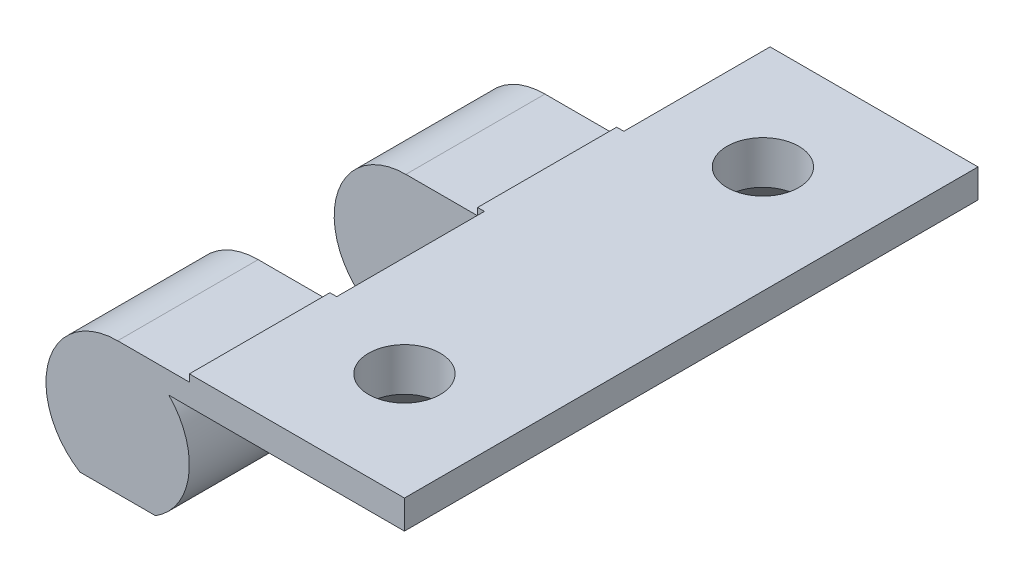
ISO-10303-21;
HEADER;
FILE_DESCRIPTION(('STEP AP214'),'2;1');
FILE_NAME('part.step','',(''),(''),'','','');
FILE_SCHEMA(('AUTOMOTIVE_DESIGN { 1 0 10303 214 1 1 1 1 }'));
ENDSEC;
DATA;
#1=APPLICATION_CONTEXT('core data for automotive mechanical design processes');
#2=APPLICATION_PROTOCOL_DEFINITION('international standard','automotive_design',2000,#1);
#3=PRODUCT_CONTEXT('',#1,'mechanical');
#4=PRODUCT('Part','Part','',(#3));
#5=PRODUCT_RELATED_PRODUCT_CATEGORY('part','',(#4));
#6=PRODUCT_DEFINITION_FORMATION('','',#4);
#7=PRODUCT_DEFINITION_CONTEXT('part definition',#1,'design');
#8=PRODUCT_DEFINITION('design','',#6,#7);
#9=PRODUCT_DEFINITION_SHAPE('','',#8);
#10=(LENGTH_UNIT() NAMED_UNIT(*) SI_UNIT(.MILLI.,.METRE.));
#11=(NAMED_UNIT(*) PLANE_ANGLE_UNIT() SI_UNIT($,.RADIAN.));
#12=(NAMED_UNIT(*) SI_UNIT($,.STERADIAN.) SOLID_ANGLE_UNIT());
#13=UNCERTAINTY_MEASURE_WITH_UNIT(LENGTH_MEASURE(1.E-05),#10,'distance_accuracy_value','');
#14=(GEOMETRIC_REPRESENTATION_CONTEXT(3) GLOBAL_UNCERTAINTY_ASSIGNED_CONTEXT((#13)) GLOBAL_UNIT_ASSIGNED_CONTEXT((#10,
#11,#12)) REPRESENTATION_CONTEXT('',''));
#15=CARTESIAN_POINT('',(0.,0.,0.));
#16=DIRECTION('',(0.,0.,1.));
#17=DIRECTION('',(1.,0.,0.));
#18=AXIS2_PLACEMENT_3D('',#15,#16,#17);
#19=CARTESIAN_POINT('',(0.,0.,40.));
#20=DIRECTION('',(0.,0.,-1.));
#21=DIRECTION('',(-1.,0.,0.));
#22=AXIS2_PLACEMENT_3D('',#19,#20,#21);
#23=CYLINDRICAL_SURFACE('',#22,5.);
#24=CARTESIAN_POINT('',(0.,0.,19.9));
#25=DIRECTION('',(0.,0.,1.));
#26=DIRECTION('',(1.,0.,0.));
#27=AXIS2_PLACEMENT_3D('',#24,#25,#26);
#28=CIRCLE('',#27,5.);
#29=CARTESIAN_POINT('',(2.63391343821319,-4.25,19.9));
#30=VERTEX_POINT('',#29);
#31=CARTESIAN_POINT('',(4.9749371855331,0.5,19.9));
#32=VERTEX_POINT('',#31);
#33=EDGE_CURVE('E196',#30,#32,#28,.T.);
#34=ORIENTED_EDGE('',*,*,#33,.F.);
#35=DIRECTION('',(0.,0.,-1.));
#36=VECTOR('',#35,1.);
#37=CARTESIAN_POINT('',(2.63391343821319,-4.25,40.));
#38=LINE('',#37,#36);
#39=CARTESIAN_POINT('',(2.63391343821319,-4.25,10.2));
#40=VERTEX_POINT('',#39);
#41=EDGE_CURVE('E239',#30,#40,#38,.T.);
#42=ORIENTED_EDGE('',*,*,#41,.T.);
#43=CARTESIAN_POINT('',(0.,0.,10.2));
#44=DIRECTION('',(0.,0.,-1.));
#45=DIRECTION('',(-1.,0.,0.));
#46=AXIS2_PLACEMENT_3D('',#43,#44,#45);
#47=CIRCLE('',#46,5.);
#48=CARTESIAN_POINT('',(4.9749371855331,0.500000000000001,10.2));
#49=VERTEX_POINT('',#48);
#50=EDGE_CURVE('E221',#49,#40,#47,.T.);
#51=ORIENTED_EDGE('',*,*,#50,.F.);
#52=DIRECTION('',(0.,0.,-1.));
#53=VECTOR('',#52,1.);
#54=CARTESIAN_POINT('',(4.9749371855331,0.500000000000001,40.));
#55=LINE('',#54,#53);
#56=EDGE_CURVE('E211',#32,#49,#55,.T.);
#57=ORIENTED_EDGE('',*,*,#56,.F.);
#58=EDGE_LOOP('',(#34,#42,#51,#57));
#59=FACE_BOUND('',#58,.T.);
#60=ADVANCED_FACE('F45',(#59),#23,.T.);
#61=CARTESIAN_POINT('',(0.,0.,19.9));
#62=DIRECTION('',(0.,0.,1.));
#63=DIRECTION('',(1.,0.,0.));
#64=AXIS2_PLACEMENT_3D('',#61,#62,#63);
#65=CIRCLE('',#64,5.);
#66=CARTESIAN_POINT('',(0.,5.,19.9));
#67=VERTEX_POINT('',#66);
#68=CARTESIAN_POINT('',(-2.63391343821319,-4.25,19.9));
#69=VERTEX_POINT('',#68);
#70=EDGE_CURVE('E550',#67,#69,#65,.T.);
#71=ORIENTED_EDGE('',*,*,#70,.F.);
#72=DIRECTION('',(0.,0.,-1.));
#73=VECTOR('',#72,1.);
#74=CARTESIAN_POINT('',(0.,5.,40.));
#75=LINE('',#74,#73);
#76=CARTESIAN_POINT('',(0.,5.,10.2));
#77=VERTEX_POINT('',#76);
#78=EDGE_CURVE('E432',#67,#77,#75,.T.);
#79=ORIENTED_EDGE('',*,*,#78,.T.);
#80=CARTESIAN_POINT('',(0.,0.,10.2));
#81=DIRECTION('',(0.,0.,-1.));
#82=DIRECTION('',(-1.,0.,0.));
#83=AXIS2_PLACEMENT_3D('',#80,#81,#82);
#84=CIRCLE('',#83,5.);
#85=CARTESIAN_POINT('',(-2.63391343821319,-4.25,10.2));
#86=VERTEX_POINT('',#85);
#87=EDGE_CURVE('E566',#86,#77,#84,.T.);
#88=ORIENTED_EDGE('',*,*,#87,.F.);
#89=DIRECTION('',(0.,0.,-1.));
#90=VECTOR('',#89,1.);
#91=CARTESIAN_POINT('',(-2.63391343821319,-4.25,40.));
#92=LINE('',#91,#90);
#93=EDGE_CURVE('E235',#86,#69,#92,.F.);
#94=ORIENTED_EDGE('',*,*,#93,.T.);
#95=EDGE_LOOP('',(#71,#79,#88,#94));
#96=FACE_BOUND('',#95,.T.);
#97=ADVANCED_FACE('F322',(#96),#23,.T.);
#98=CARTESIAN_POINT('',(5.,5.5,40.));
#99=DIRECTION('',(1.,0.,0.));
#100=DIRECTION('',(0.,0.,-1.));
#101=AXIS2_PLACEMENT_3D('',#98,#99,#100);
#102=PLANE('',#101);
#103=DIRECTION('',(0.,-1.,0.));
#104=VECTOR('',#103,1.);
#105=CARTESIAN_POINT('',(5.,5.5,19.9));
#106=LINE('',#105,#104);
#107=CARTESIAN_POINT('',(5.,5.5,19.9));
#108=VERTEX_POINT('',#107);
#109=CARTESIAN_POINT('',(5.,5.,19.9));
#110=VERTEX_POINT('',#109);
#111=EDGE_CURVE('E460',#108,#110,#106,.T.);
#112=ORIENTED_EDGE('',*,*,#111,.F.);
#113=DIRECTION('',(0.,0.,-1.));
#114=VECTOR('',#113,1.);
#115=CARTESIAN_POINT('',(5.,5.5,40.));
#116=LINE('',#115,#114);
#117=CARTESIAN_POINT('',(5.,5.5,10.2));
#118=VERTEX_POINT('',#117);
#119=EDGE_CURVE('E445',#108,#118,#116,.T.);
#120=ORIENTED_EDGE('',*,*,#119,.T.);
#121=DIRECTION('',(0.,1.,0.));
#122=VECTOR('',#121,1.);
#123=CARTESIAN_POINT('',(5.,5.,10.2));
#124=LINE('',#123,#122);
#125=CARTESIAN_POINT('',(5.,5.,10.2));
#126=VERTEX_POINT('',#125);
#127=EDGE_CURVE('E459',#126,#118,#124,.T.);
#128=ORIENTED_EDGE('',*,*,#127,.F.);
#129=DIRECTION('',(0.,0.,-1.));
#130=VECTOR('',#129,1.);
#131=CARTESIAN_POINT('',(5.,5.,40.));
#132=LINE('',#131,#130);
#133=EDGE_CURVE('E441',#110,#126,#132,.T.);
#134=ORIENTED_EDGE('',*,*,#133,.F.);
#135=EDGE_LOOP('',(#112,#120,#128,#134));
#136=FACE_BOUND('',#135,.T.);
#137=ADVANCED_FACE('F329',(#136),#102,.F.);
#138=CARTESIAN_POINT('',(0.,5.,40.));
#139=DIRECTION('',(0.,-1.,0.));
#140=DIRECTION('',(0.,0.,-1.));
#141=AXIS2_PLACEMENT_3D('',#138,#139,#140);
#142=PLANE('',#141);
#143=DIRECTION('',(-1.,0.,0.));
#144=VECTOR('',#143,1.);
#145=CARTESIAN_POINT('',(5.,5.,19.9));
#146=LINE('',#145,#144);
#147=EDGE_CURVE('E547',#110,#67,#146,.T.);
#148=ORIENTED_EDGE('',*,*,#147,.F.);
#149=ORIENTED_EDGE('',*,*,#133,.T.);
#150=DIRECTION('',(1.,0.,0.));
#151=VECTOR('',#150,1.);
#152=CARTESIAN_POINT('',(0.,5.,10.2));
#153=LINE('',#152,#151);
#154=EDGE_CURVE('E472',#77,#126,#153,.T.);
#155=ORIENTED_EDGE('',*,*,#154,.F.);
#156=ORIENTED_EDGE('',*,*,#78,.F.);
#157=EDGE_LOOP('',(#148,#149,#155,#156));
#158=FACE_BOUND('',#157,.T.);
#159=ADVANCED_FACE('F344',(#158),#142,.F.);
#160=CARTESIAN_POINT('',(-6.33676251112338,-4.25,100.405530582886));
#161=DIRECTION('',(0.,1.,0.));
#162=DIRECTION('',(0.,0.,1.));
#163=AXIS2_PLACEMENT_3D('',#160,#161,#162);
#164=PLANE('',#163);
#165=DIRECTION('',(1.,0.,0.));
#166=VECTOR('',#165,1.);
#167=CARTESIAN_POINT('',(-2.63391343821319,-4.25,19.9));
#168=LINE('',#167,#166);
#169=EDGE_CURVE('E202',#69,#30,#168,.T.);
#170=ORIENTED_EDGE('',*,*,#169,.F.);
#171=ORIENTED_EDGE('',*,*,#93,.F.);
#172=DIRECTION('',(-1.,0.,0.));
#173=VECTOR('',#172,1.);
#174=CARTESIAN_POINT('',(2.63391343821319,-4.25,10.2));
#175=LINE('',#174,#173);
#176=EDGE_CURVE('E563',#40,#86,#175,.T.);
#177=ORIENTED_EDGE('',*,*,#176,.F.);
#178=ORIENTED_EDGE('',*,*,#41,.F.);
#179=EDGE_LOOP('',(#170,#171,#177,#178));
#180=FACE_BOUND('',#179,.T.);
#181=ADVANCED_FACE('F573',(#180),#164,.F.);
#182=DIRECTION('',(0.,1.,0.));
#183=VECTOR('',#182,1.);
#184=CARTESIAN_POINT('',(5.,5.,30.2));
#185=LINE('',#184,#183);
#186=CARTESIAN_POINT('',(5.,5.,30.2));
#187=VERTEX_POINT('',#186);
#188=CARTESIAN_POINT('',(5.,5.5,30.2));
#189=VERTEX_POINT('',#188);
#190=EDGE_CURVE('E488',#187,#189,#185,.T.);
#191=ORIENTED_EDGE('',*,*,#190,.F.);
#192=CARTESIAN_POINT('',(5.,5.,40.));
#193=VERTEX_POINT('',#192);
#194=EDGE_CURVE('E442',#193,#187,#132,.T.);
#195=ORIENTED_EDGE('',*,*,#194,.F.);
#196=DIRECTION('',(0.,-1.,0.));
#197=VECTOR('',#196,1.);
#198=CARTESIAN_POINT('',(5.,5.5,40.));
#199=LINE('',#198,#197);
#200=CARTESIAN_POINT('',(5.,5.5,40.));
#201=VERTEX_POINT('',#200);
#202=EDGE_CURVE('E426',#201,#193,#199,.T.);
#203=ORIENTED_EDGE('',*,*,#202,.F.);
#204=EDGE_CURVE('E231',#201,#189,#116,.T.);
#205=ORIENTED_EDGE('',*,*,#204,.T.);
#206=EDGE_LOOP('',(#191,#195,#203,#205));
#207=FACE_BOUND('',#206,.T.);
#208=ADVANCED_FACE('F345',(#207),#102,.F.);
#209=CARTESIAN_POINT('',(0.,0.,30.2));
#210=DIRECTION('',(0.,0.,-1.));
#211=DIRECTION('',(-1.,0.,0.));
#212=AXIS2_PLACEMENT_3D('',#209,#210,#211);
#213=CIRCLE('',#212,5.);
#214=CARTESIAN_POINT('',(4.9749371855331,0.5,30.2));
#215=VERTEX_POINT('',#214);
#216=CARTESIAN_POINT('',(2.63391343821319,-4.25,30.2));
#217=VERTEX_POINT('',#216);
#218=EDGE_CURVE('E502',#215,#217,#213,.T.);
#219=ORIENTED_EDGE('',*,*,#218,.F.);
#220=CARTESIAN_POINT('',(4.9749371855331,0.500000000000001,37.));
#221=VERTEX_POINT('',#220);
#222=EDGE_CURVE('E223',#221,#215,#55,.T.);
#223=ORIENTED_EDGE('',*,*,#222,.F.);
#224=CARTESIAN_POINT('',(0.,0.,36.5));
#225=DIRECTION('',(0.,-0.707106781186549,0.707106781186546));
#226=DIRECTION('',(0.,-0.707106781186546,-0.707106781186549));
#227=AXIS2_PLACEMENT_3D('',#224,#225,#226);
#228=ELLIPSE('',#227,7.07106781186549,5.);
#229=CARTESIAN_POINT('',(3.57071421427142,3.5,40.));
#230=VERTEX_POINT('',#229);
#231=EDGE_CURVE('E270',#221,#230,#228,.T.);
#232=ORIENTED_EDGE('',*,*,#231,.T.);
#233=CARTESIAN_POINT('',(0.,0.,40.));
#234=DIRECTION('',(0.,0.,1.));
#235=DIRECTION('',(1.,0.,0.));
#236=AXIS2_PLACEMENT_3D('',#233,#234,#235);
#237=CIRCLE('',#236,5.);
#238=CARTESIAN_POINT('',(2.63391343821319,-4.25,40.));
#239=VERTEX_POINT('',#238);
#240=EDGE_CURVE('E420',#239,#230,#237,.T.);
#241=ORIENTED_EDGE('',*,*,#240,.F.);
#242=EDGE_CURVE('E240',#239,#217,#38,.T.);
#243=ORIENTED_EDGE('',*,*,#242,.T.);
#244=EDGE_LOOP('',(#219,#223,#232,#241,#243));
#245=FACE_BOUND('',#244,.T.);
#246=ADVANCED_FACE('F331',(#245),#23,.T.);
#247=CARTESIAN_POINT('',(0.,0.,30.2));
#248=DIRECTION('',(0.,0.,-1.));
#249=DIRECTION('',(-1.,0.,0.));
#250=AXIS2_PLACEMENT_3D('',#247,#248,#249);
#251=CIRCLE('',#250,5.);
#252=CARTESIAN_POINT('',(-2.63391343821319,-4.25,30.2));
#253=VERTEX_POINT('',#252);
#254=CARTESIAN_POINT('',(0.,5.,30.2));
#255=VERTEX_POINT('',#254);
#256=EDGE_CURVE('E349',#253,#255,#251,.T.);
#257=ORIENTED_EDGE('',*,*,#256,.F.);
#258=CARTESIAN_POINT('',(-2.63391343821319,-4.25,40.));
#259=VERTEX_POINT('',#258);
#260=EDGE_CURVE('E229',#253,#259,#92,.F.);
#261=ORIENTED_EDGE('',*,*,#260,.T.);
#262=CARTESIAN_POINT('',(0.,5.,40.));
#263=VERTEX_POINT('',#262);
#264=EDGE_CURVE('E416',#263,#259,#237,.T.);
#265=ORIENTED_EDGE('',*,*,#264,.F.);
#266=EDGE_CURVE('E354',#263,#255,#75,.T.);
#267=ORIENTED_EDGE('',*,*,#266,.T.);
#268=EDGE_LOOP('',(#257,#261,#265,#267));
#269=FACE_BOUND('',#268,.T.);
#270=ADVANCED_FACE('F324',(#269),#23,.T.);
#271=DIRECTION('',(1.,0.,0.));
#272=VECTOR('',#271,1.);
#273=CARTESIAN_POINT('',(0.,5.,30.2));
#274=LINE('',#273,#272);
#275=EDGE_CURVE('E357',#255,#187,#274,.T.);
#276=ORIENTED_EDGE('',*,*,#275,.F.);
#277=ORIENTED_EDGE('',*,*,#266,.F.);
#278=DIRECTION('',(-1.,0.,0.));
#279=VECTOR('',#278,1.);
#280=CARTESIAN_POINT('',(0.,5.,40.));
#281=LINE('',#280,#279);
#282=EDGE_CURVE('E429',#193,#263,#281,.T.);
#283=ORIENTED_EDGE('',*,*,#282,.F.);
#284=ORIENTED_EDGE('',*,*,#194,.T.);
#285=EDGE_LOOP('',(#276,#277,#283,#284));
#286=FACE_BOUND('',#285,.T.);
#287=ADVANCED_FACE('F335',(#286),#142,.F.);
#288=DIRECTION('',(-1.,0.,0.));
#289=VECTOR('',#288,1.);
#290=CARTESIAN_POINT('',(2.63391343821319,-4.25,30.2));
#291=LINE('',#290,#289);
#292=EDGE_CURVE('E362',#217,#253,#291,.T.);
#293=ORIENTED_EDGE('',*,*,#292,.F.);
#294=ORIENTED_EDGE('',*,*,#242,.F.);
#295=DIRECTION('',(-1.,0.,0.));
#296=VECTOR('',#295,1.);
#297=CARTESIAN_POINT('',(0.,-4.25,40.));
#298=LINE('',#297,#296);
#299=EDGE_CURVE('E364',#239,#259,#298,.T.);
#300=ORIENTED_EDGE('',*,*,#299,.T.);
#301=ORIENTED_EDGE('',*,*,#260,.F.);
#302=EDGE_LOOP('',(#293,#294,#300,#301));
#303=FACE_BOUND('',#302,.T.);
#304=ADVANCED_FACE('F341',(#303),#164,.F.);
#305=CARTESIAN_POINT('',(20.,0.500000000000001,40.));
#306=DIRECTION('',(0.,1.,0.));
#307=DIRECTION('',(0.,0.,1.));
#308=AXIS2_PLACEMENT_3D('',#305,#306,#307);
#309=PLANE('',#308);
#310=DIRECTION('',(0.,0.,1.));
#311=VECTOR('',#310,1.);
#312=CARTESIAN_POINT('',(5.4749371855331,0.500000000000001,30.));
#313=LINE('',#312,#311);
#314=CARTESIAN_POINT('',(5.4749371855331,0.500000000000001,19.9));
#315=VERTEX_POINT('',#314);
#316=CARTESIAN_POINT('',(5.4749371855331,0.500000000000001,30.2));
#317=VERTEX_POINT('',#316);
#318=EDGE_CURVE('E214',#315,#317,#313,.T.);
#319=ORIENTED_EDGE('',*,*,#318,.F.);
#320=DIRECTION('',(1.,0.,0.));
#321=VECTOR('',#320,1.);
#322=CARTESIAN_POINT('',(4.9749371855331,0.5,19.9));
#323=LINE('',#322,#321);
#324=EDGE_CURVE('E200',#32,#315,#323,.T.);
#325=ORIENTED_EDGE('',*,*,#324,.F.);
#326=ORIENTED_EDGE('',*,*,#56,.T.);
#327=DIRECTION('',(-1.,0.,0.));
#328=VECTOR('',#327,1.);
#329=CARTESIAN_POINT('',(5.5,0.500000000000001,10.2));
#330=LINE('',#329,#328);
#331=CARTESIAN_POINT('',(5.5,0.500000000000001,10.2));
#332=VERTEX_POINT('',#331);
#333=EDGE_CURVE('E358',#332,#49,#330,.T.);
#334=ORIENTED_EDGE('',*,*,#333,.F.);
#335=DIRECTION('',(0.,0.,1.));
#336=VECTOR('',#335,1.);
#337=CARTESIAN_POINT('',(5.5,0.500000000000001,9.99999999999999));
#338=LINE('',#337,#336);
#339=CARTESIAN_POINT('',(5.5,0.500000000000001,3.00000000000002));
#340=VERTEX_POINT('',#339);
#341=EDGE_CURVE('E507',#340,#332,#338,.T.);
#342=ORIENTED_EDGE('',*,*,#341,.F.);
#343=DIRECTION('',(1.,0.,0.));
#344=VECTOR('',#343,1.);
#345=CARTESIAN_POINT('',(20.,0.500000000000001,3.00000000000002));
#346=LINE('',#345,#344);
#347=CARTESIAN_POINT('',(12.5,0.500000000000001,3.00000000000002));
#348=VERTEX_POINT('',#347);
#349=EDGE_CURVE('E256',#340,#348,#346,.T.);
#350=ORIENTED_EDGE('',*,*,#349,.T.);
#351=CARTESIAN_POINT('',(12.5,0.500000000000001,7.5));
#352=DIRECTION('',(0.,1.,0.));
#353=DIRECTION('',(0.,0.,1.));
#354=AXIS2_PLACEMENT_3D('',#351,#352,#353);
#355=CIRCLE('',#354,4.50000000000001);
#356=CARTESIAN_POINT('',(17.,0.500000000000001,7.5));
#357=VERTEX_POINT('',#356);
#358=EDGE_CURVE('E55',#348,#357,#355,.T.);
#359=ORIENTED_EDGE('',*,*,#358,.T.);
#360=DIRECTION('',(0.,0.,1.));
#361=VECTOR('',#360,1.);
#362=CARTESIAN_POINT('',(17.,0.500000000000001,40.));
#363=LINE('',#362,#361);
#364=CARTESIAN_POINT('',(17.,0.500000000000001,32.5));
#365=VERTEX_POINT('',#364);
#366=EDGE_CURVE('E255',#357,#365,#363,.T.);
#367=ORIENTED_EDGE('',*,*,#366,.T.);
#368=CARTESIAN_POINT('',(12.5,0.500000000000001,32.5));
#369=DIRECTION('',(0.,1.,0.));
#370=DIRECTION('',(0.,0.,1.));
#371=AXIS2_PLACEMENT_3D('',#368,#369,#370);
#372=CIRCLE('',#371,4.50000000000001);
#373=CARTESIAN_POINT('',(12.5,0.500000000000001,37.));
#374=VERTEX_POINT('',#373);
#375=EDGE_CURVE('E63',#365,#374,#372,.T.);
#376=ORIENTED_EDGE('',*,*,#375,.T.);
#377=DIRECTION('',(-1.,0.,0.));
#378=VECTOR('',#377,1.);
#379=CARTESIAN_POINT('',(4.9749371855331,0.500000000000001,37.));
#380=LINE('',#379,#378);
#381=EDGE_CURVE('E244',#374,#221,#380,.T.);
#382=ORIENTED_EDGE('',*,*,#381,.T.);
#383=ORIENTED_EDGE('',*,*,#222,.T.);
#384=DIRECTION('',(-1.,0.,0.));
#385=VECTOR('',#384,1.);
#386=CARTESIAN_POINT('',(5.4749371855331,0.500000000000001,30.2));
#387=LINE('',#386,#385);
#388=EDGE_CURVE('E499',#317,#215,#387,.T.);
#389=ORIENTED_EDGE('',*,*,#388,.F.);
#390=EDGE_LOOP('',(#319,#325,#326,#334,#342,#350,#359,#367,#376,#382,#383,#389));
#391=FACE_BOUND('',#390,.T.);
#392=ADVANCED_FACE('F209',(#391),#309,.F.);
#393=CARTESIAN_POINT('',(17.,0.500000000000001,37.));
#394=VERTEX_POINT('',#393);
#395=EDGE_CURVE('E245',#394,#374,#380,.T.);
#396=ORIENTED_EDGE('',*,*,#395,.T.);
#397=CARTESIAN_POINT('',(12.5,0.500000000000001,32.5));
#398=DIRECTION('',(0.,1.,0.));
#399=DIRECTION('',(0.,0.,1.));
#400=AXIS2_PLACEMENT_3D('',#397,#398,#399);
#401=CIRCLE('',#400,4.50000000000001);
#402=EDGE_CURVE('E293',#374,#365,#401,.T.);
#403=ORIENTED_EDGE('',*,*,#402,.T.);
#404=EDGE_CURVE('E249',#365,#394,#363,.T.);
#405=ORIENTED_EDGE('',*,*,#404,.T.);
#406=EDGE_LOOP('',(#396,#403,#405));
#407=FACE_BOUND('',#406,.T.);
#408=ADVANCED_FACE('F594',(#407),#309,.F.);
#409=CARTESIAN_POINT('',(0.,0.,40.));
#410=DIRECTION('',(0.,0.,1.));
#411=DIRECTION('',(1.,0.,0.));
#412=AXIS2_PLACEMENT_3D('',#409,#410,#411);
#413=PLANE('',#412);
#414=ORIENTED_EDGE('',*,*,#240,.T.);
#415=DIRECTION('',(1.,0.,0.));
#416=VECTOR('',#415,1.);
#417=CARTESIAN_POINT('',(20.,3.5,40.));
#418=LINE('',#417,#416);
#419=CARTESIAN_POINT('',(20.,3.5,40.));
#420=VERTEX_POINT('',#419);
#421=EDGE_CURVE('E267',#230,#420,#418,.T.);
#422=ORIENTED_EDGE('',*,*,#421,.T.);
#423=DIRECTION('',(0.,1.,0.));
#424=VECTOR('',#423,1.);
#425=CARTESIAN_POINT('',(20.,5.,40.));
#426=LINE('',#425,#424);
#427=CARTESIAN_POINT('',(20.,5.5,40.));
#428=VERTEX_POINT('',#427);
#429=EDGE_CURVE('E419',#420,#428,#426,.T.);
#430=ORIENTED_EDGE('',*,*,#429,.T.);
#431=DIRECTION('',(-1.,0.,0.));
#432=VECTOR('',#431,1.);
#433=CARTESIAN_POINT('',(20.,5.5,40.));
#434=LINE('',#433,#432);
#435=EDGE_CURVE('E423',#428,#201,#434,.T.);
#436=ORIENTED_EDGE('',*,*,#435,.T.);
#437=ORIENTED_EDGE('',*,*,#202,.T.);
#438=ORIENTED_EDGE('',*,*,#282,.T.);
#439=ORIENTED_EDGE('',*,*,#264,.T.);
#440=ORIENTED_EDGE('',*,*,#299,.F.);
#441=EDGE_LOOP('',(#414,#422,#430,#436,#437,#438,#439,#440));
#442=FACE_BOUND('',#441,.T.);
#443=ADVANCED_FACE('F532',(#442),#413,.T.);
#444=CARTESIAN_POINT('',(0.,0.,0.));
#445=DIRECTION('',(0.,0.,1.));
#446=DIRECTION('',(1.,0.,0.));
#447=AXIS2_PLACEMENT_3D('',#444,#445,#446);
#448=PLANE('',#447);
#449=DIRECTION('',(-1.,0.,0.));
#450=VECTOR('',#449,1.);
#451=CARTESIAN_POINT('',(0.,3.5,0.));
#452=LINE('',#451,#450);
#453=CARTESIAN_POINT('',(20.,3.5,0.));
#454=VERTEX_POINT('',#453);
#455=CARTESIAN_POINT('',(5.5,3.5,0.));
#456=VERTEX_POINT('',#455);
#457=EDGE_CURVE('E260',#454,#456,#452,.T.);
#458=ORIENTED_EDGE('',*,*,#457,.T.);
#459=DIRECTION('',(0.,-1.,0.));
#460=VECTOR('',#459,1.);
#461=CARTESIAN_POINT('',(5.5,5.5,0.));
#462=LINE('',#461,#460);
#463=CARTESIAN_POINT('',(5.5,5.5,0.));
#464=VERTEX_POINT('',#463);
#465=EDGE_CURVE('E510',#464,#456,#462,.T.);
#466=ORIENTED_EDGE('',*,*,#465,.F.);
#467=DIRECTION('',(-1.,0.,0.));
#468=VECTOR('',#467,1.);
#469=CARTESIAN_POINT('',(20.,5.5,0.));
#470=LINE('',#469,#468);
#471=CARTESIAN_POINT('',(20.,5.5,0.));
#472=VERTEX_POINT('',#471);
#473=EDGE_CURVE('E435',#472,#464,#470,.T.);
#474=ORIENTED_EDGE('',*,*,#473,.F.);
#475=DIRECTION('',(0.,1.,0.));
#476=VECTOR('',#475,1.);
#477=CARTESIAN_POINT('',(20.,5.,0.));
#478=LINE('',#477,#476);
#479=EDGE_CURVE('E410',#454,#472,#478,.T.);
#480=ORIENTED_EDGE('',*,*,#479,.F.);
#481=EDGE_LOOP('',(#458,#466,#474,#480));
#482=FACE_BOUND('',#481,.T.);
#483=ADVANCED_FACE('F577',(#482),#448,.F.);
#484=CARTESIAN_POINT('',(17.,0.500000000000001,3.00000000000002));
#485=VERTEX_POINT('',#484);
#486=EDGE_CURVE('E250',#485,#357,#363,.T.);
#487=ORIENTED_EDGE('',*,*,#486,.T.);
#488=CARTESIAN_POINT('',(12.5,0.500000000000001,7.5));
#489=DIRECTION('',(0.,1.,0.));
#490=DIRECTION('',(0.,0.,1.));
#491=AXIS2_PLACEMENT_3D('',#488,#489,#490);
#492=CIRCLE('',#491,4.50000000000001);
#493=EDGE_CURVE('E296',#357,#348,#492,.T.);
#494=ORIENTED_EDGE('',*,*,#493,.T.);
#495=EDGE_CURVE('E254',#348,#485,#346,.T.);
#496=ORIENTED_EDGE('',*,*,#495,.T.);
#497=EDGE_LOOP('',(#487,#494,#496));
#498=FACE_BOUND('',#497,.T.);
#499=ADVANCED_FACE('F374',(#498),#309,.F.);
#500=CARTESIAN_POINT('',(20.,5.,40.));
#501=DIRECTION('',(-1.,0.,0.));
#502=DIRECTION('',(0.,0.,1.));
#503=AXIS2_PLACEMENT_3D('',#500,#501,#502);
#504=PLANE('',#503);
#505=ORIENTED_EDGE('',*,*,#429,.F.);
#506=DIRECTION('',(0.,0.,-1.));
#507=VECTOR('',#506,1.);
#508=CARTESIAN_POINT('',(20.,3.5,40.));
#509=LINE('',#508,#507);
#510=EDGE_CURVE('E264',#420,#454,#509,.T.);
#511=ORIENTED_EDGE('',*,*,#510,.T.);
#512=ORIENTED_EDGE('',*,*,#479,.T.);
#513=DIRECTION('',(0.,0.,-1.));
#514=VECTOR('',#513,1.);
#515=CARTESIAN_POINT('',(20.,5.5,40.));
#516=LINE('',#515,#514);
#517=EDGE_CURVE('E224',#428,#472,#516,.T.);
#518=ORIENTED_EDGE('',*,*,#517,.F.);
#519=EDGE_LOOP('',(#505,#511,#512,#518));
#520=FACE_BOUND('',#519,.T.);
#521=ADVANCED_FACE('F535',(#520),#504,.F.);
#522=CARTESIAN_POINT('',(20.,5.5,40.));
#523=DIRECTION('',(0.,-1.,0.));
#524=DIRECTION('',(0.,0.,-1.));
#525=AXIS2_PLACEMENT_3D('',#522,#523,#524);
#526=PLANE('',#525);
#527=CARTESIAN_POINT('',(12.5,5.5,32.5));
#528=DIRECTION('',(0.,-1.,0.));
#529=DIRECTION('',(0.,0.,1.));
#530=AXIS2_PLACEMENT_3D('',#527,#528,#529);
#531=CIRCLE('',#530,2.5);
#532=CARTESIAN_POINT('',(12.5,5.5,35.));
#533=VERTEX_POINT('',#532);
#534=EDGE_CURVE('E284',#533,#533,#531,.T.);
#535=ORIENTED_EDGE('',*,*,#534,.T.);
#536=EDGE_LOOP('',(#535));
#537=FACE_BOUND('',#536,.T.);
#538=CARTESIAN_POINT('',(12.5,5.5,7.5));
#539=DIRECTION('',(0.,-1.,0.));
#540=DIRECTION('',(0.,0.,-1.));
#541=AXIS2_PLACEMENT_3D('',#538,#539,#540);
#542=CIRCLE('',#541,2.5);
#543=CARTESIAN_POINT('',(12.5,5.5,5.));
#544=VERTEX_POINT('',#543);
#545=EDGE_CURVE('E404',#544,#544,#542,.T.);
#546=ORIENTED_EDGE('',*,*,#545,.T.);
#547=EDGE_LOOP('',(#546));
#548=FACE_BOUND('',#547,.T.);
#549=DIRECTION('',(-1.,0.,0.));
#550=VECTOR('',#549,1.);
#551=CARTESIAN_POINT('',(5.4749371855331,5.5,19.9));
#552=LINE('',#551,#550);
#553=CARTESIAN_POINT('',(5.4749371855331,5.5,19.9));
#554=VERTEX_POINT('',#553);
#555=EDGE_CURVE('E555',#554,#108,#552,.T.);
#556=ORIENTED_EDGE('',*,*,#555,.F.);
#557=DIRECTION('',(0.,0.,1.));
#558=VECTOR('',#557,1.);
#559=CARTESIAN_POINT('',(5.4749371855331,5.5,30.));
#560=LINE('',#559,#558);
#561=CARTESIAN_POINT('',(5.4749371855331,5.5,30.2));
#562=VERTEX_POINT('',#561);
#563=EDGE_CURVE('E280',#554,#562,#560,.T.);
#564=ORIENTED_EDGE('',*,*,#563,.T.);
#565=DIRECTION('',(1.,0.,0.));
#566=VECTOR('',#565,1.);
#567=CARTESIAN_POINT('',(5.,5.5,30.2));
#568=LINE('',#567,#566);
#569=EDGE_CURVE('E491',#189,#562,#568,.T.);
#570=ORIENTED_EDGE('',*,*,#569,.F.);
#571=ORIENTED_EDGE('',*,*,#204,.F.);
#572=ORIENTED_EDGE('',*,*,#435,.F.);
#573=ORIENTED_EDGE('',*,*,#517,.T.);
#574=ORIENTED_EDGE('',*,*,#473,.T.);
#575=DIRECTION('',(0.,0.,1.));
#576=VECTOR('',#575,1.);
#577=CARTESIAN_POINT('',(5.5,5.5,9.99999999999999));
#578=LINE('',#577,#576);
#579=CARTESIAN_POINT('',(5.5,5.5,10.2));
#580=VERTEX_POINT('',#579);
#581=EDGE_CURVE('E475',#464,#580,#578,.T.);
#582=ORIENTED_EDGE('',*,*,#581,.T.);
#583=DIRECTION('',(1.,0.,0.));
#584=VECTOR('',#583,1.);
#585=CARTESIAN_POINT('',(5.,5.5,10.2));
#586=LINE('',#585,#584);
#587=EDGE_CURVE('E469',#118,#580,#586,.T.);
#588=ORIENTED_EDGE('',*,*,#587,.F.);
#589=ORIENTED_EDGE('',*,*,#119,.F.);
#590=EDGE_LOOP('',(#556,#564,#570,#571,#572,#573,#574,#582,#588,#589));
#591=FACE_BOUND('',#590,.T.);
#592=ADVANCED_FACE('F400',(#537,#548,#591),#526,.F.);
#593=CARTESIAN_POINT('',(12.5,5.5,7.5));
#594=DIRECTION('',(0.,-1.,0.));
#595=DIRECTION('',(0.,0.,-1.));
#596=AXIS2_PLACEMENT_3D('',#593,#594,#595);
#597=CYLINDRICAL_SURFACE('',#596,2.5);
#598=CARTESIAN_POINT('',(12.5,2.50000000000001,7.5));
#599=DIRECTION('',(0.,1.,0.));
#600=DIRECTION('',(0.,0.,1.));
#601=AXIS2_PLACEMENT_3D('',#598,#599,#600);
#602=CIRCLE('',#601,2.5);
#603=CARTESIAN_POINT('',(12.5,2.50000000000001,10.));
#604=VERTEX_POINT('',#603);
#605=EDGE_CURVE('E287',#604,#604,#602,.F.);
#606=ORIENTED_EDGE('',*,*,#605,.T.);
#607=EDGE_LOOP('',(#606));
#608=FACE_BOUND('',#607,.T.);
#609=ORIENTED_EDGE('',*,*,#545,.F.);
#610=EDGE_LOOP('',(#609));
#611=FACE_BOUND('',#610,.T.);
#612=ADVANCED_FACE('F396',(#608,#611),#597,.F.);
#613=CARTESIAN_POINT('',(12.5,5.5,32.5));
#614=DIRECTION('',(0.,-1.,0.));
#615=DIRECTION('',(0.,0.,-1.));
#616=AXIS2_PLACEMENT_3D('',#613,#614,#615);
#617=CYLINDRICAL_SURFACE('',#616,2.5);
#618=CARTESIAN_POINT('',(12.5,2.50000000000001,32.5));
#619=DIRECTION('',(0.,1.,0.));
#620=DIRECTION('',(0.,0.,1.));
#621=AXIS2_PLACEMENT_3D('',#618,#619,#620);
#622=CIRCLE('',#621,2.5);
#623=CARTESIAN_POINT('',(12.5,2.50000000000001,35.));
#624=VERTEX_POINT('',#623);
#625=EDGE_CURVE('E11',#624,#624,#622,.F.);
#626=ORIENTED_EDGE('',*,*,#625,.T.);
#627=EDGE_LOOP('',(#626));
#628=FACE_BOUND('',#627,.T.);
#629=ORIENTED_EDGE('',*,*,#534,.F.);
#630=EDGE_LOOP('',(#629));
#631=FACE_BOUND('',#630,.T.);
#632=ADVANCED_FACE('F399',(#628,#631),#617,.F.);
#633=CARTESIAN_POINT('',(0.,3.5,40.));
#634=DIRECTION('',(0.,-0.707106781186549,0.707106781186546));
#635=DIRECTION('',(-1.,0.,0.));
#636=AXIS2_PLACEMENT_3D('',#633,#634,#635);
#637=PLANE('',#636);
#638=ORIENTED_EDGE('',*,*,#231,.F.);
#639=ORIENTED_EDGE('',*,*,#381,.F.);
#640=ORIENTED_EDGE('',*,*,#395,.F.);
#641=DIRECTION('',(-0.577350269189627,-0.577350269189624,-0.577350269189627));
#642=VECTOR('',#641,1.);
#643=CARTESIAN_POINT('',(13.3333333333333,-3.16666666666665,33.3333333333333));
#644=LINE('',#643,#642);
#645=EDGE_CURVE('E279',#420,#394,#644,.T.);
#646=ORIENTED_EDGE('',*,*,#645,.F.);
#647=ORIENTED_EDGE('',*,*,#421,.F.);
#648=EDGE_LOOP('',(#638,#639,#640,#646,#647));
#649=FACE_BOUND('',#648,.T.);
#650=ADVANCED_FACE('F527',(#649),#637,.T.);
#651=CARTESIAN_POINT('',(20.,3.5,40.));
#652=DIRECTION('',(-0.707106781186546,0.707106781186549,0.));
#653=DIRECTION('',(0.,0.,-1.));
#654=AXIS2_PLACEMENT_3D('',#651,#652,#653);
#655=PLANE('',#654);
#656=ORIENTED_EDGE('',*,*,#645,.T.);
#657=ORIENTED_EDGE('',*,*,#404,.F.);
#658=ORIENTED_EDGE('',*,*,#366,.F.);
#659=ORIENTED_EDGE('',*,*,#486,.F.);
#660=DIRECTION('',(0.577350269189627,0.577350269189624,-0.577350269189627));
#661=VECTOR('',#660,1.);
#662=CARTESIAN_POINT('',(6.66666666666663,-9.83333333333331,13.3333333333334));
#663=LINE('',#662,#661);
#664=EDGE_CURVE('E275',#454,#485,#663,.F.);
#665=ORIENTED_EDGE('',*,*,#664,.F.);
#666=ORIENTED_EDGE('',*,*,#510,.F.);
#667=EDGE_LOOP('',(#656,#657,#658,#659,#665,#666));
#668=FACE_BOUND('',#667,.T.);
#669=ADVANCED_FACE('F385',(#668),#655,.F.);
#670=CARTESIAN_POINT('',(20.,0.500000000000001,3.00000000000002));
#671=DIRECTION('',(0.,0.707106781186549,0.707106781186546));
#672=DIRECTION('',(1.,0.,0.));
#673=AXIS2_PLACEMENT_3D('',#670,#671,#672);
#674=PLANE('',#673);
#675=DIRECTION('',(0.,0.707106781186546,-0.707106781186549));
#676=VECTOR('',#675,1.);
#677=CARTESIAN_POINT('',(5.5,0.500000000000002,3.00000000000002));
#678=LINE('',#677,#676);
#679=EDGE_CURVE('E274',#456,#340,#678,.F.);
#680=ORIENTED_EDGE('',*,*,#679,.F.);
#681=ORIENTED_EDGE('',*,*,#457,.F.);
#682=ORIENTED_EDGE('',*,*,#664,.T.);
#683=ORIENTED_EDGE('',*,*,#495,.F.);
#684=ORIENTED_EDGE('',*,*,#349,.F.);
#685=EDGE_LOOP('',(#680,#681,#682,#683,#684));
#686=FACE_BOUND('',#685,.T.);
#687=ADVANCED_FACE('F381',(#686),#674,.F.);
#688=CARTESIAN_POINT('',(5.4749371855331,5.5,30.));
#689=DIRECTION('',(1.,0.,0.));
#690=DIRECTION('',(0.,0.,-1.));
#691=AXIS2_PLACEMENT_3D('',#688,#689,#690);
#692=PLANE('',#691);
#693=ORIENTED_EDGE('',*,*,#318,.T.);
#694=DIRECTION('',(0.,-1.,0.));
#695=VECTOR('',#694,1.);
#696=CARTESIAN_POINT('',(5.4749371855331,5.5,30.2));
#697=LINE('',#696,#695);
#698=EDGE_CURVE('E495',#562,#317,#697,.T.);
#699=ORIENTED_EDGE('',*,*,#698,.F.);
#700=ORIENTED_EDGE('',*,*,#563,.F.);
#701=DIRECTION('',(0.,1.,0.));
#702=VECTOR('',#701,1.);
#703=CARTESIAN_POINT('',(5.4749371855331,0.500000000000001,19.9));
#704=LINE('',#703,#702);
#705=EDGE_CURVE('E217',#315,#554,#704,.T.);
#706=ORIENTED_EDGE('',*,*,#705,.F.);
#707=EDGE_LOOP('',(#693,#699,#700,#706));
#708=FACE_BOUND('',#707,.T.);
#709=ADVANCED_FACE('F519',(#708),#692,.F.);
#710=CARTESIAN_POINT('',(5.5,5.5,9.99999999999999));
#711=DIRECTION('',(1.,0.,0.));
#712=DIRECTION('',(0.,0.,-1.));
#713=AXIS2_PLACEMENT_3D('',#710,#711,#712);
#714=PLANE('',#713);
#715=ORIENTED_EDGE('',*,*,#679,.T.);
#716=ORIENTED_EDGE('',*,*,#341,.T.);
#717=DIRECTION('',(0.,-1.,0.));
#718=VECTOR('',#717,1.);
#719=CARTESIAN_POINT('',(5.5,5.5,10.2));
#720=LINE('',#719,#718);
#721=EDGE_CURVE('E478',#580,#332,#720,.T.);
#722=ORIENTED_EDGE('',*,*,#721,.F.);
#723=ORIENTED_EDGE('',*,*,#581,.F.);
#724=ORIENTED_EDGE('',*,*,#465,.T.);
#725=EDGE_LOOP('',(#715,#716,#722,#723,#724));
#726=FACE_BOUND('',#725,.T.);
#727=ADVANCED_FACE('F393',(#726),#714,.F.);
#728=CARTESIAN_POINT('',(12.5,2.50000000000001,7.5));
#729=DIRECTION('',(0.,-1.,0.));
#730=DIRECTION('',(0.,0.,-1.));
#731=AXIS2_PLACEMENT_3D('',#728,#729,#730);
#732=CONICAL_SURFACE('',#731,2.5,0.78539816339745);
#733=ORIENTED_EDGE('',*,*,#493,.F.);
#734=ORIENTED_EDGE('',*,*,#358,.F.);
#735=EDGE_LOOP('',(#733,#734));
#736=FACE_BOUND('',#735,.T.);
#737=ORIENTED_EDGE('',*,*,#605,.F.);
#738=EDGE_LOOP('',(#737));
#739=FACE_BOUND('',#738,.T.);
#740=ADVANCED_FACE('F390',(#736,#739),#732,.F.);
#741=CARTESIAN_POINT('',(12.5,2.50000000000001,32.5));
#742=DIRECTION('',(0.,-1.,0.));
#743=DIRECTION('',(0.,0.,-1.));
#744=AXIS2_PLACEMENT_3D('',#741,#742,#743);
#745=CONICAL_SURFACE('',#744,2.5,0.78539816339745);
#746=ORIENTED_EDGE('',*,*,#375,.F.);
#747=ORIENTED_EDGE('',*,*,#402,.F.);
#748=EDGE_LOOP('',(#746,#747));
#749=FACE_BOUND('',#748,.T.);
#750=ORIENTED_EDGE('',*,*,#625,.F.);
#751=EDGE_LOOP('',(#750));
#752=FACE_BOUND('',#751,.T.);
#753=ADVANCED_FACE('F47',(#749,#752),#745,.F.);
#754=CARTESIAN_POINT('',(0.,0.,30.2));
#755=DIRECTION('',(0.,0.,-1.));
#756=DIRECTION('',(-1.,0.,0.));
#757=AXIS2_PLACEMENT_3D('',#754,#755,#756);
#758=PLANE('',#757);
#759=CARTESIAN_POINT('',(0.,0.375,30.2));
#760=DIRECTION('',(0.,0.,-1.));
#761=DIRECTION('',(-1.,0.,0.));
#762=AXIS2_PLACEMENT_3D('',#759,#760,#761);
#763=CIRCLE('',#762,3.);
#764=CARTESIAN_POINT('',(-3.,0.375,30.2));
#765=VERTEX_POINT('',#764);
#766=EDGE_CURVE('E49',#765,#765,#763,.F.);
#767=ORIENTED_EDGE('',*,*,#766,.T.);
#768=EDGE_LOOP('',(#767));
#769=FACE_BOUND('',#768,.T.);
#770=ORIENTED_EDGE('',*,*,#256,.T.);
#771=ORIENTED_EDGE('',*,*,#275,.T.);
#772=ORIENTED_EDGE('',*,*,#190,.T.);
#773=ORIENTED_EDGE('',*,*,#569,.T.);
#774=ORIENTED_EDGE('',*,*,#698,.T.);
#775=ORIENTED_EDGE('',*,*,#388,.T.);
#776=ORIENTED_EDGE('',*,*,#218,.T.);
#777=ORIENTED_EDGE('',*,*,#292,.T.);
#778=EDGE_LOOP('',(#770,#771,#772,#773,#774,#775,#776,#777));
#779=FACE_BOUND('',#778,.T.);
#780=ADVANCED_FACE('F309',(#769,#779),#758,.T.);
#781=CARTESIAN_POINT('',(0.,0.,10.2));
#782=DIRECTION('',(0.,0.,-1.));
#783=DIRECTION('',(-1.,0.,0.));
#784=AXIS2_PLACEMENT_3D('',#781,#782,#783);
#785=PLANE('',#784);
#786=CARTESIAN_POINT('',(0.,0.375,10.2));
#787=DIRECTION('',(0.,0.,-1.));
#788=DIRECTION('',(-1.,0.,0.));
#789=AXIS2_PLACEMENT_3D('',#786,#787,#788);
#790=CIRCLE('',#789,3.);
#791=CARTESIAN_POINT('',(-3.,0.375,10.2));
#792=VERTEX_POINT('',#791);
#793=EDGE_CURVE('E207',#792,#792,#790,.F.);
#794=ORIENTED_EDGE('',*,*,#793,.T.);
#795=EDGE_LOOP('',(#794));
#796=FACE_BOUND('',#795,.T.);
#797=ORIENTED_EDGE('',*,*,#50,.T.);
#798=ORIENTED_EDGE('',*,*,#176,.T.);
#799=ORIENTED_EDGE('',*,*,#87,.T.);
#800=ORIENTED_EDGE('',*,*,#154,.T.);
#801=ORIENTED_EDGE('',*,*,#127,.T.);
#802=ORIENTED_EDGE('',*,*,#587,.T.);
#803=ORIENTED_EDGE('',*,*,#721,.T.);
#804=ORIENTED_EDGE('',*,*,#333,.T.);
#805=EDGE_LOOP('',(#797,#798,#799,#800,#801,#802,#803,#804));
#806=FACE_BOUND('',#805,.T.);
#807=ADVANCED_FACE('F467',(#796,#806),#785,.T.);
#808=CARTESIAN_POINT('',(0.,0.,19.9));
#809=DIRECTION('',(0.,0.,1.));
#810=DIRECTION('',(1.,0.,0.));
#811=AXIS2_PLACEMENT_3D('',#808,#809,#810);
#812=PLANE('',#811);
#813=ORIENTED_EDGE('',*,*,#33,.T.);
#814=ORIENTED_EDGE('',*,*,#324,.T.);
#815=ORIENTED_EDGE('',*,*,#705,.T.);
#816=ORIENTED_EDGE('',*,*,#555,.T.);
#817=ORIENTED_EDGE('',*,*,#111,.T.);
#818=ORIENTED_EDGE('',*,*,#147,.T.);
#819=ORIENTED_EDGE('',*,*,#70,.T.);
#820=ORIENTED_EDGE('',*,*,#169,.T.);
#821=EDGE_LOOP('',(#813,#814,#815,#816,#817,#818,#819,#820));
#822=FACE_BOUND('',#821,.T.);
#823=ADVANCED_FACE('F198',(#822),#812,.T.);
#824=CARTESIAN_POINT('',(0.,0.375,10.2));
#825=DIRECTION('',(0.,0.,1.));
#826=DIRECTION('',(1.,0.,0.));
#827=AXIS2_PLACEMENT_3D('',#824,#825,#826);
#828=SPHERICAL_SURFACE('',#827,3.);
#829=ORIENTED_EDGE('',*,*,#793,.F.);
#830=EDGE_LOOP('',(#829));
#831=FACE_BOUND('',#830,.T.);
#832=ADVANCED_FACE('F314',(#831),#828,.T.);
#833=CARTESIAN_POINT('',(0.,0.375,30.2));
#834=DIRECTION('',(0.,0.,1.));
#835=DIRECTION('',(-1.,0.,0.));
#836=AXIS2_PLACEMENT_3D('',#833,#834,#835);
#837=SPHERICAL_SURFACE('',#836,3.);
#838=ORIENTED_EDGE('',*,*,#766,.F.);
#839=EDGE_LOOP('',(#838));
#840=FACE_BOUND('',#839,.T.);
#841=ADVANCED_FACE('F312',(#840),#837,.F.);
#842=CLOSED_SHELL('',(#60,#97,#137,#159,#181,#208,#246,#270,#287,#304,#392,#408,#443,#483,#499,
#521,#592,#612,#632,#650,#669,#687,#709,#727,#740,#753,#780,#807,#823,#832,#841));
#843=MANIFOLD_SOLID_BREP('B2',#842);
#844=ADVANCED_BREP_SHAPE_REPRESENTATION('',(#18,#843),#14);
#845=SHAPE_DEFINITION_REPRESENTATION(#9,#844);
ENDSEC;
END-ISO-10303-21;
